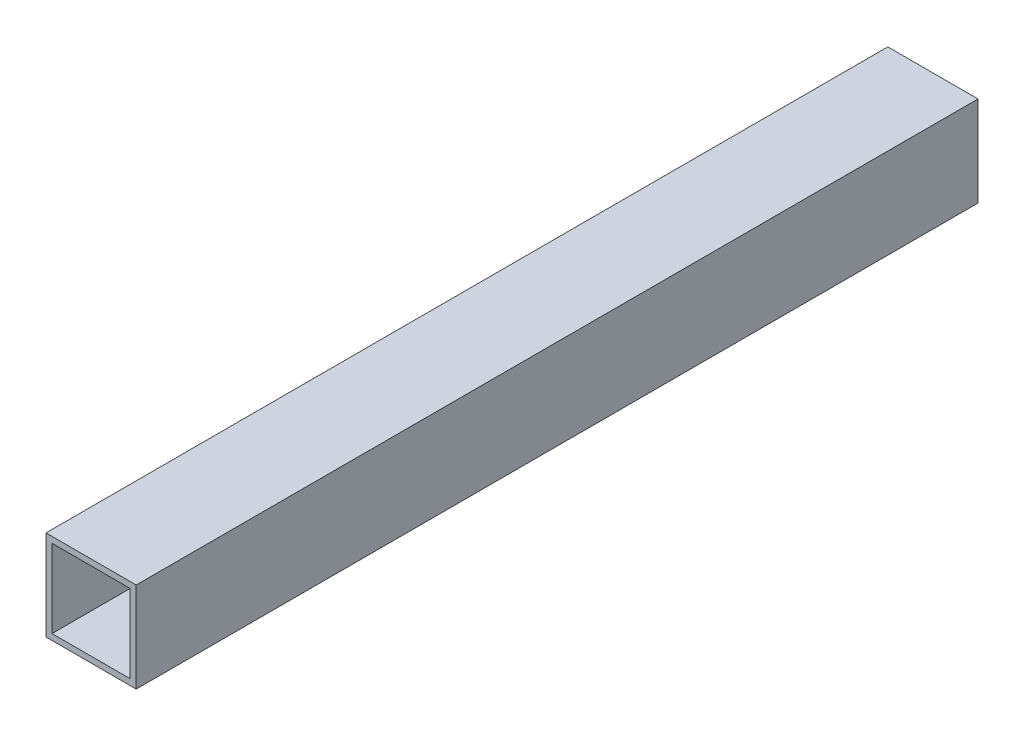
ISO-10303-21;
HEADER;
FILE_DESCRIPTION(('STEP AP214'),'2;1');
FILE_NAME('part.step','',(''),(''),'','','');
FILE_SCHEMA(('AUTOMOTIVE_DESIGN { 1 0 10303 214 1 1 1 1 }'));
ENDSEC;
DATA;
#1=APPLICATION_CONTEXT('core data for automotive mechanical design processes');
#2=APPLICATION_PROTOCOL_DEFINITION('international standard','automotive_design',2000,#1);
#3=PRODUCT_CONTEXT('',#1,'mechanical');
#4=PRODUCT('Part','Part','',(#3));
#5=PRODUCT_RELATED_PRODUCT_CATEGORY('part','',(#4));
#6=PRODUCT_DEFINITION_FORMATION('','',#4);
#7=PRODUCT_DEFINITION_CONTEXT('part definition',#1,'design');
#8=PRODUCT_DEFINITION('design','',#6,#7);
#9=PRODUCT_DEFINITION_SHAPE('','',#8);
#10=(LENGTH_UNIT() NAMED_UNIT(*) SI_UNIT(.MILLI.,.METRE.));
#11=(NAMED_UNIT(*) PLANE_ANGLE_UNIT() SI_UNIT($,.RADIAN.));
#12=(NAMED_UNIT(*) SI_UNIT($,.STERADIAN.) SOLID_ANGLE_UNIT());
#13=UNCERTAINTY_MEASURE_WITH_UNIT(LENGTH_MEASURE(1.E-05),#10,'distance_accuracy_value','');
#14=(GEOMETRIC_REPRESENTATION_CONTEXT(3) GLOBAL_UNCERTAINTY_ASSIGNED_CONTEXT((#13)) GLOBAL_UNIT_ASSIGNED_CONTEXT((#10,
#11,#12)) REPRESENTATION_CONTEXT('',''));
#15=CARTESIAN_POINT('',(0.,0.,0.));
#16=DIRECTION('',(0.,0.,1.));
#17=DIRECTION('',(1.,0.,0.));
#18=AXIS2_PLACEMENT_3D('',#15,#16,#17);
#19=CARTESIAN_POINT('',(0.,0.,140.));
#20=DIRECTION('',(0.,0.,-1.));
#21=DIRECTION('',(-1.,0.,0.));
#22=AXIS2_PLACEMENT_3D('',#19,#20,#21);
#23=PLANE('',#22);
#24=DIRECTION('',(0.,1.,0.));
#25=VECTOR('',#24,1.);
#26=CARTESIAN_POINT('',(7.5,-7.5,140.));
#27=LINE('',#26,#25);
#28=CARTESIAN_POINT('',(7.5,-7.5,140.));
#29=VERTEX_POINT('',#28);
#30=CARTESIAN_POINT('',(7.5,7.5,140.));
#31=VERTEX_POINT('',#30);
#32=EDGE_CURVE('E143',#29,#31,#27,.T.);
#33=ORIENTED_EDGE('',*,*,#32,.T.);
#34=DIRECTION('',(-1.,0.,0.));
#35=VECTOR('',#34,1.);
#36=CARTESIAN_POINT('',(-7.5,7.5,140.));
#37=LINE('',#36,#35);
#38=CARTESIAN_POINT('',(-7.5,7.5,140.));
#39=VERTEX_POINT('',#38);
#40=EDGE_CURVE('E150',#31,#39,#37,.T.);
#41=ORIENTED_EDGE('',*,*,#40,.T.);
#42=DIRECTION('',(0.,-1.,0.));
#43=VECTOR('',#42,1.);
#44=CARTESIAN_POINT('',(-7.5,-7.5,140.));
#45=LINE('',#44,#43);
#46=CARTESIAN_POINT('',(-7.5,-7.5,140.));
#47=VERTEX_POINT('',#46);
#48=EDGE_CURVE('E148',#39,#47,#45,.T.);
#49=ORIENTED_EDGE('',*,*,#48,.T.);
#50=DIRECTION('',(1.,0.,0.));
#51=VECTOR('',#50,1.);
#52=CARTESIAN_POINT('',(-7.5,-7.5,140.));
#53=LINE('',#52,#51);
#54=EDGE_CURVE('E152',#47,#29,#53,.T.);
#55=ORIENTED_EDGE('',*,*,#54,.T.);
#56=EDGE_LOOP('',(#33,#41,#49,#55));
#57=FACE_BOUND('',#56,.T.);
#58=DIRECTION('',(0.,-1.,0.));
#59=VECTOR('',#58,1.);
#60=CARTESIAN_POINT('',(-6.5,-6.5,140.));
#61=LINE('',#60,#59);
#62=CARTESIAN_POINT('',(-6.5,6.5,140.));
#63=VERTEX_POINT('',#62);
#64=CARTESIAN_POINT('',(-6.5,-6.5,140.));
#65=VERTEX_POINT('',#64);
#66=EDGE_CURVE('E109',#63,#65,#61,.T.);
#67=ORIENTED_EDGE('',*,*,#66,.F.);
#68=DIRECTION('',(-1.,0.,0.));
#69=VECTOR('',#68,1.);
#70=CARTESIAN_POINT('',(-6.5,6.5,140.));
#71=LINE('',#70,#69);
#72=CARTESIAN_POINT('',(6.5,6.5,140.));
#73=VERTEX_POINT('',#72);
#74=EDGE_CURVE('E127',#73,#63,#71,.T.);
#75=ORIENTED_EDGE('',*,*,#74,.F.);
#76=DIRECTION('',(0.,1.,0.));
#77=VECTOR('',#76,1.);
#78=CARTESIAN_POINT('',(6.5,-6.5,140.));
#79=LINE('',#78,#77);
#80=CARTESIAN_POINT('',(6.5,-6.5,140.));
#81=VERTEX_POINT('',#80);
#82=EDGE_CURVE('E126',#81,#73,#79,.T.);
#83=ORIENTED_EDGE('',*,*,#82,.F.);
#84=DIRECTION('',(1.,0.,0.));
#85=VECTOR('',#84,1.);
#86=CARTESIAN_POINT('',(-6.5,-6.5,140.));
#87=LINE('',#86,#85);
#88=EDGE_CURVE('E116',#65,#81,#87,.T.);
#89=ORIENTED_EDGE('',*,*,#88,.F.);
#90=EDGE_LOOP('',(#67,#75,#83,#89));
#91=FACE_BOUND('',#90,.T.);
#92=ADVANCED_FACE('F43',(#57,#91),#23,.F.);
#93=CARTESIAN_POINT('',(0.,0.,0.));
#94=DIRECTION('',(0.,0.,-1.));
#95=DIRECTION('',(-1.,0.,0.));
#96=AXIS2_PLACEMENT_3D('',#93,#94,#95);
#97=PLANE('',#96);
#98=DIRECTION('',(0.,1.,0.));
#99=VECTOR('',#98,1.);
#100=CARTESIAN_POINT('',(7.5,-7.5,0.));
#101=LINE('',#100,#99);
#102=CARTESIAN_POINT('',(7.5,-7.5,0.));
#103=VERTEX_POINT('',#102);
#104=CARTESIAN_POINT('',(7.5,7.5,0.));
#105=VERTEX_POINT('',#104);
#106=EDGE_CURVE('E125',#103,#105,#101,.T.);
#107=ORIENTED_EDGE('',*,*,#106,.F.);
#108=DIRECTION('',(1.,0.,0.));
#109=VECTOR('',#108,1.);
#110=CARTESIAN_POINT('',(-7.5,-7.5,0.));
#111=LINE('',#110,#109);
#112=CARTESIAN_POINT('',(-7.5,-7.5,0.));
#113=VERTEX_POINT('',#112);
#114=EDGE_CURVE('E149',#113,#103,#111,.T.);
#115=ORIENTED_EDGE('',*,*,#114,.F.);
#116=DIRECTION('',(0.,-1.,0.));
#117=VECTOR('',#116,1.);
#118=CARTESIAN_POINT('',(-7.5,-7.5,0.));
#119=LINE('',#118,#117);
#120=CARTESIAN_POINT('',(-7.5,7.5,0.));
#121=VERTEX_POINT('',#120);
#122=EDGE_CURVE('E159',#121,#113,#119,.T.);
#123=ORIENTED_EDGE('',*,*,#122,.F.);
#124=DIRECTION('',(-1.,0.,0.));
#125=VECTOR('',#124,1.);
#126=CARTESIAN_POINT('',(-7.5,7.5,0.));
#127=LINE('',#126,#125);
#128=EDGE_CURVE('E160',#105,#121,#127,.T.);
#129=ORIENTED_EDGE('',*,*,#128,.F.);
#130=EDGE_LOOP('',(#107,#115,#123,#129));
#131=FACE_BOUND('',#130,.T.);
#132=DIRECTION('',(-1.,0.,0.));
#133=VECTOR('',#132,1.);
#134=CARTESIAN_POINT('',(-6.5,6.5,0.));
#135=LINE('',#134,#133);
#136=CARTESIAN_POINT('',(6.5,6.5,0.));
#137=VERTEX_POINT('',#136);
#138=CARTESIAN_POINT('',(-6.5,6.5,0.));
#139=VERTEX_POINT('',#138);
#140=EDGE_CURVE('E117',#137,#139,#135,.T.);
#141=ORIENTED_EDGE('',*,*,#140,.T.);
#142=DIRECTION('',(0.,-1.,0.));
#143=VECTOR('',#142,1.);
#144=CARTESIAN_POINT('',(-6.5,-6.5,0.));
#145=LINE('',#144,#143);
#146=CARTESIAN_POINT('',(-6.5,-6.5,0.));
#147=VERTEX_POINT('',#146);
#148=EDGE_CURVE('E67',#139,#147,#145,.T.);
#149=ORIENTED_EDGE('',*,*,#148,.T.);
#150=DIRECTION('',(1.,0.,0.));
#151=VECTOR('',#150,1.);
#152=CARTESIAN_POINT('',(-6.5,-6.5,0.));
#153=LINE('',#152,#151);
#154=CARTESIAN_POINT('',(6.5,-6.5,0.));
#155=VERTEX_POINT('',#154);
#156=EDGE_CURVE('E121',#147,#155,#153,.T.);
#157=ORIENTED_EDGE('',*,*,#156,.T.);
#158=DIRECTION('',(0.,1.,0.));
#159=VECTOR('',#158,1.);
#160=CARTESIAN_POINT('',(6.5,-6.5,0.));
#161=LINE('',#160,#159);
#162=EDGE_CURVE('E136',#155,#137,#161,.T.);
#163=ORIENTED_EDGE('',*,*,#162,.T.);
#164=EDGE_LOOP('',(#141,#149,#157,#163));
#165=FACE_BOUND('',#164,.T.);
#166=ADVANCED_FACE('F180',(#131,#165),#97,.T.);
#167=CARTESIAN_POINT('',(7.5,-7.5,140.));
#168=DIRECTION('',(-1.,0.,0.));
#169=DIRECTION('',(0.,0.,1.));
#170=AXIS2_PLACEMENT_3D('',#167,#168,#169);
#171=PLANE('',#170);
#172=ORIENTED_EDGE('',*,*,#106,.T.);
#173=DIRECTION('',(0.,0.,-1.));
#174=VECTOR('',#173,1.);
#175=CARTESIAN_POINT('',(7.5,7.5,140.));
#176=LINE('',#175,#174);
#177=EDGE_CURVE('E11',#31,#105,#176,.T.);
#178=ORIENTED_EDGE('',*,*,#177,.F.);
#179=ORIENTED_EDGE('',*,*,#32,.F.);
#180=DIRECTION('',(0.,0.,-1.));
#181=VECTOR('',#180,1.);
#182=CARTESIAN_POINT('',(7.5,-7.5,140.));
#183=LINE('',#182,#181);
#184=EDGE_CURVE('E153',#29,#103,#183,.T.);
#185=ORIENTED_EDGE('',*,*,#184,.T.);
#186=EDGE_LOOP('',(#172,#178,#179,#185));
#187=FACE_BOUND('',#186,.T.);
#188=ADVANCED_FACE('F44',(#187),#171,.F.);
#189=CARTESIAN_POINT('',(-7.5,7.5,140.));
#190=DIRECTION('',(0.,-1.,0.));
#191=DIRECTION('',(0.,0.,-1.));
#192=AXIS2_PLACEMENT_3D('',#189,#190,#191);
#193=PLANE('',#192);
#194=ORIENTED_EDGE('',*,*,#128,.T.);
#195=DIRECTION('',(0.,0.,-1.));
#196=VECTOR('',#195,1.);
#197=CARTESIAN_POINT('',(-7.5,7.5,140.));
#198=LINE('',#197,#196);
#199=EDGE_CURVE('E51',#39,#121,#198,.T.);
#200=ORIENTED_EDGE('',*,*,#199,.F.);
#201=ORIENTED_EDGE('',*,*,#40,.F.);
#202=ORIENTED_EDGE('',*,*,#177,.T.);
#203=EDGE_LOOP('',(#194,#200,#201,#202));
#204=FACE_BOUND('',#203,.T.);
#205=ADVANCED_FACE('F190',(#204),#193,.F.);
#206=CARTESIAN_POINT('',(-7.5,-7.5,140.));
#207=DIRECTION('',(1.,0.,0.));
#208=DIRECTION('',(0.,0.,-1.));
#209=AXIS2_PLACEMENT_3D('',#206,#207,#208);
#210=PLANE('',#209);
#211=ORIENTED_EDGE('',*,*,#122,.T.);
#212=DIRECTION('',(0.,0.,-1.));
#213=VECTOR('',#212,1.);
#214=CARTESIAN_POINT('',(-7.5,-7.5,140.));
#215=LINE('',#214,#213);
#216=EDGE_CURVE('E163',#47,#113,#215,.T.);
#217=ORIENTED_EDGE('',*,*,#216,.F.);
#218=ORIENTED_EDGE('',*,*,#48,.F.);
#219=ORIENTED_EDGE('',*,*,#199,.T.);
#220=EDGE_LOOP('',(#211,#217,#218,#219));
#221=FACE_BOUND('',#220,.T.);
#222=ADVANCED_FACE('F173',(#221),#210,.F.);
#223=CARTESIAN_POINT('',(-7.5,-7.5,140.));
#224=DIRECTION('',(0.,1.,0.));
#225=DIRECTION('',(0.,0.,1.));
#226=AXIS2_PLACEMENT_3D('',#223,#224,#225);
#227=PLANE('',#226);
#228=ORIENTED_EDGE('',*,*,#114,.T.);
#229=ORIENTED_EDGE('',*,*,#184,.F.);
#230=ORIENTED_EDGE('',*,*,#54,.F.);
#231=ORIENTED_EDGE('',*,*,#216,.T.);
#232=EDGE_LOOP('',(#228,#229,#230,#231));
#233=FACE_BOUND('',#232,.T.);
#234=ADVANCED_FACE('F181',(#233),#227,.F.);
#235=CARTESIAN_POINT('',(-6.5,-6.5,140.));
#236=DIRECTION('',(1.,0.,0.));
#237=DIRECTION('',(0.,0.,-1.));
#238=AXIS2_PLACEMENT_3D('',#235,#236,#237);
#239=PLANE('',#238);
#240=ORIENTED_EDGE('',*,*,#148,.F.);
#241=DIRECTION('',(0.,0.,-1.));
#242=VECTOR('',#241,1.);
#243=CARTESIAN_POINT('',(-6.5,6.5,140.));
#244=LINE('',#243,#242);
#245=EDGE_CURVE('E115',#63,#139,#244,.T.);
#246=ORIENTED_EDGE('',*,*,#245,.F.);
#247=ORIENTED_EDGE('',*,*,#66,.T.);
#248=DIRECTION('',(0.,0.,-1.));
#249=VECTOR('',#248,1.);
#250=CARTESIAN_POINT('',(-6.5,-6.5,140.));
#251=LINE('',#250,#249);
#252=EDGE_CURVE('E112',#65,#147,#251,.T.);
#253=ORIENTED_EDGE('',*,*,#252,.T.);
#254=EDGE_LOOP('',(#240,#246,#247,#253));
#255=FACE_BOUND('',#254,.T.);
#256=ADVANCED_FACE('F110',(#255),#239,.T.);
#257=CARTESIAN_POINT('',(-6.5,-6.5,140.));
#258=DIRECTION('',(0.,1.,0.));
#259=DIRECTION('',(0.,0.,1.));
#260=AXIS2_PLACEMENT_3D('',#257,#258,#259);
#261=PLANE('',#260);
#262=ORIENTED_EDGE('',*,*,#156,.F.);
#263=ORIENTED_EDGE('',*,*,#252,.F.);
#264=ORIENTED_EDGE('',*,*,#88,.T.);
#265=DIRECTION('',(0.,0.,-1.));
#266=VECTOR('',#265,1.);
#267=CARTESIAN_POINT('',(6.5,-6.5,140.));
#268=LINE('',#267,#266);
#269=EDGE_CURVE('E124',#81,#155,#268,.T.);
#270=ORIENTED_EDGE('',*,*,#269,.T.);
#271=EDGE_LOOP('',(#262,#263,#264,#270));
#272=FACE_BOUND('',#271,.T.);
#273=ADVANCED_FACE('F120',(#272),#261,.T.);
#274=CARTESIAN_POINT('',(6.5,-6.5,140.));
#275=DIRECTION('',(-1.,0.,0.));
#276=DIRECTION('',(0.,-1.,0.));
#277=AXIS2_PLACEMENT_3D('',#274,#275,#276);
#278=PLANE('',#277);
#279=ORIENTED_EDGE('',*,*,#162,.F.);
#280=ORIENTED_EDGE('',*,*,#269,.F.);
#281=ORIENTED_EDGE('',*,*,#82,.T.);
#282=DIRECTION('',(0.,0.,-1.));
#283=VECTOR('',#282,1.);
#284=CARTESIAN_POINT('',(6.5,6.5,140.));
#285=LINE('',#284,#283);
#286=EDGE_CURVE('E59',#73,#137,#285,.T.);
#287=ORIENTED_EDGE('',*,*,#286,.T.);
#288=EDGE_LOOP('',(#279,#280,#281,#287));
#289=FACE_BOUND('',#288,.T.);
#290=ADVANCED_FACE('F210',(#289),#278,.T.);
#291=CARTESIAN_POINT('',(-6.5,6.5,140.));
#292=DIRECTION('',(0.,-1.,0.));
#293=DIRECTION('',(1.,0.,0.));
#294=AXIS2_PLACEMENT_3D('',#291,#292,#293);
#295=PLANE('',#294);
#296=ORIENTED_EDGE('',*,*,#140,.F.);
#297=ORIENTED_EDGE('',*,*,#286,.F.);
#298=ORIENTED_EDGE('',*,*,#74,.T.);
#299=ORIENTED_EDGE('',*,*,#245,.T.);
#300=EDGE_LOOP('',(#296,#297,#298,#299));
#301=FACE_BOUND('',#300,.T.);
#302=ADVANCED_FACE('F215',(#301),#295,.T.);
#303=CLOSED_SHELL('',(#92,#166,#188,#205,#222,#234,#256,#273,#290,#302));
#304=MANIFOLD_SOLID_BREP('B2',#303);
#305=ADVANCED_BREP_SHAPE_REPRESENTATION('',(#18,#304),#14);
#306=SHAPE_DEFINITION_REPRESENTATION(#9,#305);
ENDSEC;
END-ISO-10303-21;
